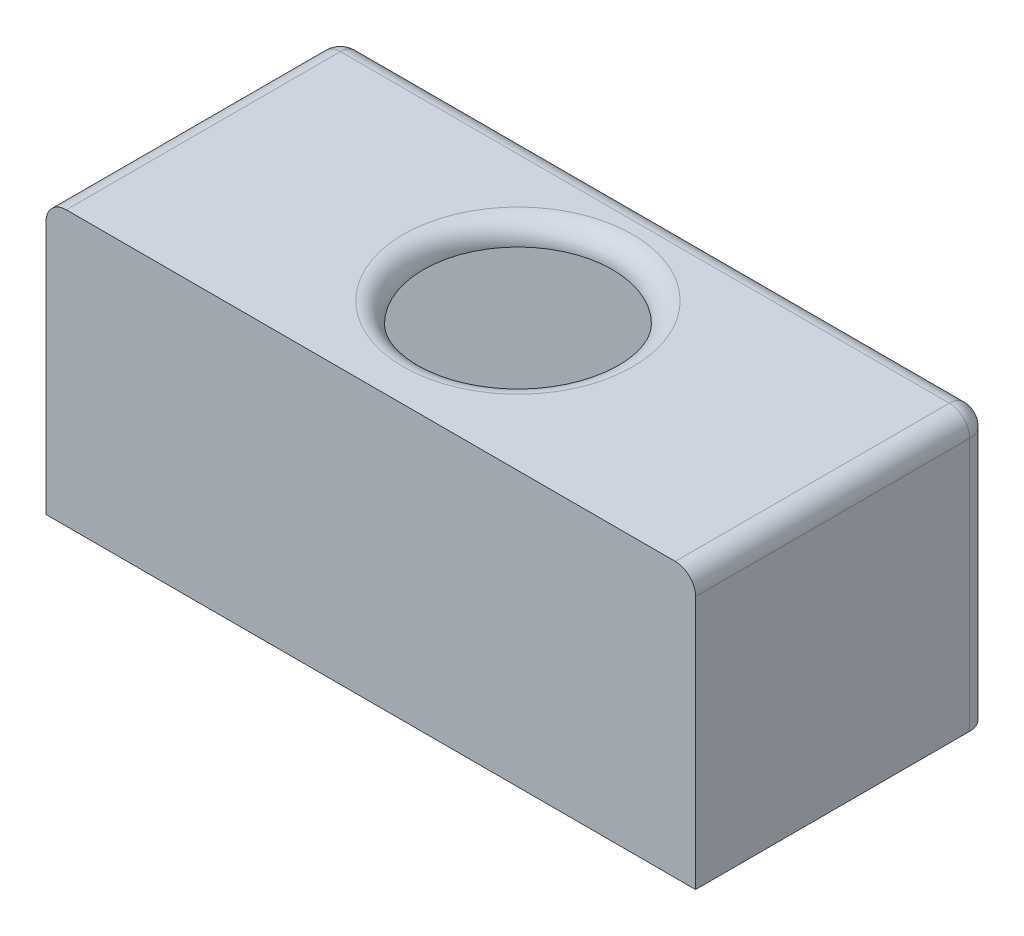
ISO-10303-21;
HEADER;
FILE_DESCRIPTION(('STEP AP214'),'2;1');
FILE_NAME('part.step','',(''),(''),'','','');
FILE_SCHEMA(('AUTOMOTIVE_DESIGN { 1 0 10303 214 1 1 1 1 }'));
ENDSEC;
DATA;
#1=APPLICATION_CONTEXT('core data for automotive mechanical design processes');
#2=APPLICATION_PROTOCOL_DEFINITION('international standard','automotive_design',2000,#1);
#3=PRODUCT_CONTEXT('',#1,'mechanical');
#4=PRODUCT('Part','Part','',(#3));
#5=PRODUCT_RELATED_PRODUCT_CATEGORY('part','',(#4));
#6=PRODUCT_DEFINITION_FORMATION('','',#4);
#7=PRODUCT_DEFINITION_CONTEXT('part definition',#1,'design');
#8=PRODUCT_DEFINITION('design','',#6,#7);
#9=PRODUCT_DEFINITION_SHAPE('','',#8);
#10=(LENGTH_UNIT() NAMED_UNIT(*) SI_UNIT(.MILLI.,.METRE.));
#11=(NAMED_UNIT(*) PLANE_ANGLE_UNIT() SI_UNIT($,.RADIAN.));
#12=(NAMED_UNIT(*) SI_UNIT($,.STERADIAN.) SOLID_ANGLE_UNIT());
#13=UNCERTAINTY_MEASURE_WITH_UNIT(LENGTH_MEASURE(1.E-05),#10,'distance_accuracy_value','');
#14=(GEOMETRIC_REPRESENTATION_CONTEXT(3) GLOBAL_UNCERTAINTY_ASSIGNED_CONTEXT((#13)) GLOBAL_UNIT_ASSIGNED_CONTEXT((#10,
#11,#12)) REPRESENTATION_CONTEXT('',''));
#15=CARTESIAN_POINT('',(0.,0.,0.));
#16=DIRECTION('',(0.,0.,1.));
#17=DIRECTION('',(1.,0.,0.));
#18=AXIS2_PLACEMENT_3D('',#15,#16,#17);
#19=CARTESIAN_POINT('',(-31.5092810457516,31.75,-17.2653594771242));
#20=DIRECTION('',(1.,0.,0.));
#21=DIRECTION('',(0.,0.,-1.));
#22=AXIS2_PLACEMENT_3D('',#19,#20,#21);
#23=PLANE('',#22);
#24=DIRECTION('',(0.,-1.,0.));
#25=VECTOR('',#24,1.);
#26=CARTESIAN_POINT('',(-31.5092810457516,31.75,17.0246405228758));
#27=LINE('',#26,#25);
#28=CARTESIAN_POINT('',(-31.5092810457516,31.75,17.0246405228758));
#29=VERTEX_POINT('',#28);
#30=CARTESIAN_POINT('',(-31.5092810457516,0.,17.0246405228758));
#31=VERTEX_POINT('',#30);
#32=EDGE_CURVE('E175',#29,#31,#27,.T.);
#33=ORIENTED_EDGE('',*,*,#32,.F.);
#34=DIRECTION('',(0.,0.,1.));
#35=VECTOR('',#34,1.);
#36=CARTESIAN_POINT('',(-31.5092810457516,31.75,-19.8053594771242));
#37=LINE('',#36,#35);
#38=CARTESIAN_POINT('',(-31.5092810457516,31.75,-17.2653594771242));
#39=VERTEX_POINT('',#38);
#40=EDGE_CURVE('E230',#29,#39,#37,.F.);
#41=ORIENTED_EDGE('',*,*,#40,.T.);
#42=DIRECTION('',(0.,-1.,0.));
#43=VECTOR('',#42,1.);
#44=CARTESIAN_POINT('',(-31.5092810457516,31.75,-17.2653594771242));
#45=LINE('',#44,#43);
#46=CARTESIAN_POINT('',(-31.5092810457516,0.,-17.2653594771242));
#47=VERTEX_POINT('',#46);
#48=EDGE_CURVE('E227',#39,#47,#45,.T.);
#49=ORIENTED_EDGE('',*,*,#48,.T.);
#50=DIRECTION('',(0.,0.,1.));
#51=VECTOR('',#50,1.);
#52=CARTESIAN_POINT('',(-31.5092810457516,0.,-17.2653594771242));
#53=LINE('',#52,#51);
#54=EDGE_CURVE('E164',#47,#31,#53,.T.);
#55=ORIENTED_EDGE('',*,*,#54,.T.);
#56=EDGE_LOOP('',(#33,#41,#49,#55));
#57=FACE_BOUND('',#56,.T.);
#58=ADVANCED_FACE('F46',(#57),#23,.F.);
#59=CARTESIAN_POINT('',(-28.9692810457516,31.75,17.0246405228758));
#60=DIRECTION('',(0.,0.,-1.));
#61=DIRECTION('',(-1.,0.,0.));
#62=AXIS2_PLACEMENT_3D('',#59,#60,#61);
#63=PLANE('',#62);
#64=DIRECTION('',(0.,-1.,0.));
#65=VECTOR('',#64,1.);
#66=CARTESIAN_POINT('',(49.7707189542484,31.75,17.0246405228758));
#67=LINE('',#66,#65);
#68=CARTESIAN_POINT('',(49.7707189542484,31.75,17.0246405228758));
#69=VERTEX_POINT('',#68);
#70=CARTESIAN_POINT('',(49.7707189542484,0.,17.0246405228758));
#71=VERTEX_POINT('',#70);
#72=EDGE_CURVE('E180',#69,#71,#67,.T.);
#73=ORIENTED_EDGE('',*,*,#72,.F.);
#74=CARTESIAN_POINT('',(47.2307189542484,31.75,17.0246405228758));
#75=DIRECTION('',(0.,0.,-1.));
#76=DIRECTION('',(-1.,0.,0.));
#77=AXIS2_PLACEMENT_3D('',#74,#75,#76);
#78=CIRCLE('',#77,2.54);
#79=CARTESIAN_POINT('',(47.2307189542484,34.29,17.0246405228758));
#80=VERTEX_POINT('',#79);
#81=EDGE_CURVE('E224',#69,#80,#78,.F.);
#82=ORIENTED_EDGE('',*,*,#81,.T.);
#83=DIRECTION('',(1.,0.,0.));
#84=VECTOR('',#83,1.);
#85=CARTESIAN_POINT('',(-28.9692810457516,34.29,17.0246405228758));
#86=LINE('',#85,#84);
#87=CARTESIAN_POINT('',(-28.9692810457516,34.29,17.0246405228758));
#88=VERTEX_POINT('',#87);
#89=EDGE_CURVE('E183',#88,#80,#86,.T.);
#90=ORIENTED_EDGE('',*,*,#89,.F.);
#91=CARTESIAN_POINT('',(-28.9692810457516,31.75,17.0246405228758));
#92=DIRECTION('',(0.,0.,-1.));
#93=DIRECTION('',(-1.,0.,0.));
#94=AXIS2_PLACEMENT_3D('',#91,#92,#93);
#95=CIRCLE('',#94,2.54);
#96=EDGE_CURVE('E221',#88,#29,#95,.F.);
#97=ORIENTED_EDGE('',*,*,#96,.T.);
#98=ORIENTED_EDGE('',*,*,#32,.T.);
#99=DIRECTION('',(1.,0.,0.));
#100=VECTOR('',#99,1.);
#101=CARTESIAN_POINT('',(-28.9692810457516,0.,17.0246405228758));
#102=LINE('',#101,#100);
#103=EDGE_CURVE('E169',#31,#71,#102,.T.);
#104=ORIENTED_EDGE('',*,*,#103,.T.);
#105=EDGE_LOOP('',(#73,#82,#90,#97,#98,#104));
#106=FACE_BOUND('',#105,.T.);
#107=ADVANCED_FACE('F289',(#106),#63,.F.);
#108=CARTESIAN_POINT('',(49.7707189542484,31.75,-17.2653594771242));
#109=DIRECTION('',(-1.,0.,0.));
#110=DIRECTION('',(0.,0.,1.));
#111=AXIS2_PLACEMENT_3D('',#108,#109,#110);
#112=PLANE('',#111);
#113=DIRECTION('',(0.,-1.,0.));
#114=VECTOR('',#113,1.);
#115=CARTESIAN_POINT('',(49.7707189542484,31.75,-17.2653594771242));
#116=LINE('',#115,#114);
#117=CARTESIAN_POINT('',(49.7707189542484,0.,-17.2653594771242));
#118=VERTEX_POINT('',#117);
#119=CARTESIAN_POINT('',(49.7707189542484,31.75,-17.2653594771242));
#120=VERTEX_POINT('',#119);
#121=EDGE_CURVE('E215',#118,#120,#116,.F.);
#122=ORIENTED_EDGE('',*,*,#121,.T.);
#123=DIRECTION('',(0.,0.,-1.));
#124=VECTOR('',#123,1.);
#125=CARTESIAN_POINT('',(49.7707189542484,31.75,17.0246405228758));
#126=LINE('',#125,#124);
#127=EDGE_CURVE('E218',#120,#69,#126,.F.);
#128=ORIENTED_EDGE('',*,*,#127,.T.);
#129=ORIENTED_EDGE('',*,*,#72,.T.);
#130=DIRECTION('',(0.,0.,-1.));
#131=VECTOR('',#130,1.);
#132=CARTESIAN_POINT('',(49.7707189542484,0.,-17.2653594771242));
#133=LINE('',#132,#131);
#134=EDGE_CURVE('E190',#71,#118,#133,.T.);
#135=ORIENTED_EDGE('',*,*,#134,.T.);
#136=EDGE_LOOP('',(#122,#128,#129,#135));
#137=FACE_BOUND('',#136,.T.);
#138=ADVANCED_FACE('F287',(#137),#112,.F.);
#139=CARTESIAN_POINT('',(-28.9692810457516,31.75,-19.8053594771242));
#140=DIRECTION('',(0.,0.,1.));
#141=DIRECTION('',(1.,0.,0.));
#142=AXIS2_PLACEMENT_3D('',#139,#140,#141);
#143=PLANE('',#142);
#144=DIRECTION('',(-1.,0.,0.));
#145=VECTOR('',#144,1.);
#146=CARTESIAN_POINT('',(49.7707189542484,31.75,-19.8053594771242));
#147=LINE('',#146,#145);
#148=CARTESIAN_POINT('',(-28.9692810457516,31.75,-19.8053594771242));
#149=VERTEX_POINT('',#148);
#150=CARTESIAN_POINT('',(47.2307189542484,31.75,-19.8053594771242));
#151=VERTEX_POINT('',#150);
#152=EDGE_CURVE('E64',#149,#151,#147,.F.);
#153=ORIENTED_EDGE('',*,*,#152,.T.);
#154=DIRECTION('',(0.,-1.,0.));
#155=VECTOR('',#154,1.);
#156=CARTESIAN_POINT('',(47.2307189542484,31.75,-19.8053594771242));
#157=LINE('',#156,#155);
#158=CARTESIAN_POINT('',(47.2307189542484,0.,-19.8053594771242));
#159=VERTEX_POINT('',#158);
#160=EDGE_CURVE('E237',#151,#159,#157,.T.);
#161=ORIENTED_EDGE('',*,*,#160,.T.);
#162=DIRECTION('',(-1.,0.,0.));
#163=VECTOR('',#162,1.);
#164=CARTESIAN_POINT('',(-28.9692810457516,0.,-19.8053594771242));
#165=LINE('',#164,#163);
#166=CARTESIAN_POINT('',(-28.9692810457516,0.,-19.8053594771242));
#167=VERTEX_POINT('',#166);
#168=EDGE_CURVE('E186',#159,#167,#165,.T.);
#169=ORIENTED_EDGE('',*,*,#168,.T.);
#170=DIRECTION('',(0.,-1.,0.));
#171=VECTOR('',#170,1.);
#172=CARTESIAN_POINT('',(-28.9692810457516,31.75,-19.8053594771242));
#173=LINE('',#172,#171);
#174=EDGE_CURVE('E69',#167,#149,#173,.F.);
#175=ORIENTED_EDGE('',*,*,#174,.T.);
#176=EDGE_LOOP('',(#153,#161,#169,#175));
#177=FACE_BOUND('',#176,.T.);
#178=ADVANCED_FACE('F299',(#177),#143,.F.);
#179=CARTESIAN_POINT('',(0.,34.29,0.));
#180=DIRECTION('',(0.,1.,0.));
#181=DIRECTION('',(0.,0.,1.));
#182=AXIS2_PLACEMENT_3D('',#179,#180,#181);
#183=PLANE('',#182);
#184=ORIENTED_EDGE('',*,*,#89,.T.);
#185=DIRECTION('',(0.,0.,-1.));
#186=VECTOR('',#185,1.);
#187=CARTESIAN_POINT('',(47.2307189542484,34.29,-19.8053594771242));
#188=LINE('',#187,#186);
#189=CARTESIAN_POINT('',(47.2307189542484,34.29,-17.2653594771242));
#190=VERTEX_POINT('',#189);
#191=EDGE_CURVE('E211',#80,#190,#188,.T.);
#192=ORIENTED_EDGE('',*,*,#191,.T.);
#193=DIRECTION('',(-1.,0.,0.));
#194=VECTOR('',#193,1.);
#195=CARTESIAN_POINT('',(-31.5092810457516,34.29,-17.2653594771242));
#196=LINE('',#195,#194);
#197=CARTESIAN_POINT('',(-28.9692810457516,34.29,-17.2653594771242));
#198=VERTEX_POINT('',#197);
#199=EDGE_CURVE('E205',#190,#198,#196,.T.);
#200=ORIENTED_EDGE('',*,*,#199,.T.);
#201=DIRECTION('',(0.,0.,1.));
#202=VECTOR('',#201,1.);
#203=CARTESIAN_POINT('',(-28.9692810457516,34.29,17.0246405228758));
#204=LINE('',#203,#202);
#205=EDGE_CURVE('E208',#198,#88,#204,.T.);
#206=ORIENTED_EDGE('',*,*,#205,.T.);
#207=EDGE_LOOP('',(#184,#192,#200,#206));
#208=FACE_BOUND('',#207,.T.);
#209=CARTESIAN_POINT('',(9.13071895424836,34.29,-1.39035947712418));
#210=DIRECTION('',(0.,1.,0.));
#211=DIRECTION('',(0.,0.,1.));
#212=AXIS2_PLACEMENT_3D('',#209,#210,#211);
#213=CIRCLE('',#212,14.351);
#214=CARTESIAN_POINT('',(9.13071895424836,34.29,12.9606405228758));
#215=VERTEX_POINT('',#214);
#216=EDGE_CURVE('E179',#215,#215,#213,.F.);
#217=ORIENTED_EDGE('',*,*,#216,.T.);
#218=EDGE_LOOP('',(#217));
#219=FACE_BOUND('',#218,.T.);
#220=ADVANCED_FACE('F307',(#208,#219),#183,.T.);
#221=CARTESIAN_POINT('',(0.,0.,0.));
#222=DIRECTION('',(0.,1.,0.));
#223=DIRECTION('',(0.,0.,1.));
#224=AXIS2_PLACEMENT_3D('',#221,#222,#223);
#225=PLANE('',#224);
#226=DIRECTION('',(-1.,0.,0.));
#227=VECTOR('',#226,1.);
#228=CARTESIAN_POINT('',(-28.9692810457516,0.,-17.2653594771242));
#229=LINE('',#228,#227);
#230=CARTESIAN_POINT('',(47.2307189542484,0.,-17.2653594771242));
#231=VERTEX_POINT('',#230);
#232=CARTESIAN_POINT('',(-28.9692810457516,0.,-17.2653594771242));
#233=VERTEX_POINT('',#232);
#234=EDGE_CURVE('E158',#231,#233,#229,.T.);
#235=ORIENTED_EDGE('',*,*,#234,.T.);
#236=DIRECTION('',(0.,0.,1.));
#237=VECTOR('',#236,1.);
#238=CARTESIAN_POINT('',(-28.9692810457516,0.,-17.2653594771242));
#239=LINE('',#238,#237);
#240=CARTESIAN_POINT('',(-28.9692810457516,0.,14.4846405228758));
#241=VERTEX_POINT('',#240);
#242=EDGE_CURVE('E201',#233,#241,#239,.T.);
#243=ORIENTED_EDGE('',*,*,#242,.T.);
#244=DIRECTION('',(1.,0.,0.));
#245=VECTOR('',#244,1.);
#246=CARTESIAN_POINT('',(-28.9692810457516,0.,14.4846405228758));
#247=LINE('',#246,#245);
#248=CARTESIAN_POINT('',(47.2307189542484,0.,14.4846405228758));
#249=VERTEX_POINT('',#248);
#250=EDGE_CURVE('E162',#241,#249,#247,.T.);
#251=ORIENTED_EDGE('',*,*,#250,.T.);
#252=DIRECTION('',(0.,0.,-1.));
#253=VECTOR('',#252,1.);
#254=CARTESIAN_POINT('',(47.2307189542484,0.,-17.2653594771242));
#255=LINE('',#254,#253);
#256=EDGE_CURVE('E506',#249,#231,#255,.T.);
#257=ORIENTED_EDGE('',*,*,#256,.T.);
#258=EDGE_LOOP('',(#235,#243,#251,#257));
#259=FACE_BOUND('',#258,.T.);
#260=ORIENTED_EDGE('',*,*,#168,.F.);
#261=CARTESIAN_POINT('',(47.2307189542484,0.,-17.2653594771242));
#262=DIRECTION('',(0.,1.,0.));
#263=DIRECTION('',(0.,0.,1.));
#264=AXIS2_PLACEMENT_3D('',#261,#262,#263);
#265=CIRCLE('',#264,2.54);
#266=EDGE_CURVE('E11',#159,#118,#265,.F.);
#267=ORIENTED_EDGE('',*,*,#266,.T.);
#268=ORIENTED_EDGE('',*,*,#134,.F.);
#269=ORIENTED_EDGE('',*,*,#103,.F.);
#270=ORIENTED_EDGE('',*,*,#54,.F.);
#271=CARTESIAN_POINT('',(-28.9692810457516,0.,-17.2653594771242));
#272=DIRECTION('',(0.,1.,0.));
#273=DIRECTION('',(0.,0.,1.));
#274=AXIS2_PLACEMENT_3D('',#271,#272,#273);
#275=CIRCLE('',#274,2.54);
#276=EDGE_CURVE('E56',#47,#167,#275,.F.);
#277=ORIENTED_EDGE('',*,*,#276,.T.);
#278=EDGE_LOOP('',(#260,#267,#268,#269,#270,#277));
#279=FACE_BOUND('',#278,.T.);
#280=ADVANCED_FACE('F297',(#259,#279),#225,.F.);
#281=CARTESIAN_POINT('',(-28.9692810457516,31.75,-17.2653594771242));
#282=DIRECTION('',(1.,0.,0.));
#283=DIRECTION('',(0.,0.,-1.));
#284=AXIS2_PLACEMENT_3D('',#281,#282,#283);
#285=PLANE('',#284);
#286=ORIENTED_EDGE('',*,*,#242,.F.);
#287=DIRECTION('',(0.,-1.,0.));
#288=VECTOR('',#287,1.);
#289=CARTESIAN_POINT('',(-28.9692810457516,31.75,-17.2653594771242));
#290=LINE('',#289,#288);
#291=CARTESIAN_POINT('',(-28.9692810457516,31.75,-17.2653594771242));
#292=VERTEX_POINT('',#291);
#293=EDGE_CURVE('E156',#292,#233,#290,.T.);
#294=ORIENTED_EDGE('',*,*,#293,.F.);
#295=DIRECTION('',(0.,0.,1.));
#296=VECTOR('',#295,1.);
#297=CARTESIAN_POINT('',(-28.9692810457516,31.75,-17.2653594771242));
#298=LINE('',#297,#296);
#299=CARTESIAN_POINT('',(-28.9692810457516,31.75,14.4846405228758));
#300=VERTEX_POINT('',#299);
#301=EDGE_CURVE('E141',#292,#300,#298,.T.);
#302=ORIENTED_EDGE('',*,*,#301,.T.);
#303=DIRECTION('',(0.,-1.,0.));
#304=VECTOR('',#303,1.);
#305=CARTESIAN_POINT('',(-28.9692810457516,31.75,14.4846405228758));
#306=LINE('',#305,#304);
#307=EDGE_CURVE('E154',#300,#241,#306,.T.);
#308=ORIENTED_EDGE('',*,*,#307,.T.);
#309=EDGE_LOOP('',(#286,#294,#302,#308));
#310=FACE_BOUND('',#309,.T.);
#311=ADVANCED_FACE('F153',(#310),#285,.T.);
#312=CARTESIAN_POINT('',(-28.9692810457516,31.75,14.4846405228758));
#313=DIRECTION('',(0.,0.,-1.));
#314=DIRECTION('',(-1.,0.,0.));
#315=AXIS2_PLACEMENT_3D('',#312,#313,#314);
#316=PLANE('',#315);
#317=ORIENTED_EDGE('',*,*,#250,.F.);
#318=ORIENTED_EDGE('',*,*,#307,.F.);
#319=DIRECTION('',(1.,0.,0.));
#320=VECTOR('',#319,1.);
#321=CARTESIAN_POINT('',(-28.9692810457516,31.75,14.4846405228758));
#322=LINE('',#321,#320);
#323=CARTESIAN_POINT('',(47.2307189542484,31.75,14.4846405228758));
#324=VERTEX_POINT('',#323);
#325=EDGE_CURVE('E137',#300,#324,#322,.T.);
#326=ORIENTED_EDGE('',*,*,#325,.T.);
#327=DIRECTION('',(0.,-1.,0.));
#328=VECTOR('',#327,1.);
#329=CARTESIAN_POINT('',(47.2307189542484,31.75,14.4846405228758));
#330=LINE('',#329,#328);
#331=EDGE_CURVE('E165',#324,#249,#330,.T.);
#332=ORIENTED_EDGE('',*,*,#331,.T.);
#333=EDGE_LOOP('',(#317,#318,#326,#332));
#334=FACE_BOUND('',#333,.T.);
#335=ADVANCED_FACE('F160',(#334),#316,.T.);
#336=CARTESIAN_POINT('',(47.2307189542484,31.75,-17.2653594771242));
#337=DIRECTION('',(-1.,0.,0.));
#338=DIRECTION('',(0.,0.,1.));
#339=AXIS2_PLACEMENT_3D('',#336,#337,#338);
#340=PLANE('',#339);
#341=ORIENTED_EDGE('',*,*,#256,.F.);
#342=ORIENTED_EDGE('',*,*,#331,.F.);
#343=DIRECTION('',(0.,0.,-1.));
#344=VECTOR('',#343,1.);
#345=CARTESIAN_POINT('',(47.2307189542484,31.75,-17.2653594771242));
#346=LINE('',#345,#344);
#347=CARTESIAN_POINT('',(47.2307189542484,31.75,-17.2653594771242));
#348=VERTEX_POINT('',#347);
#349=EDGE_CURVE('E142',#324,#348,#346,.T.);
#350=ORIENTED_EDGE('',*,*,#349,.T.);
#351=DIRECTION('',(0.,-1.,0.));
#352=VECTOR('',#351,1.);
#353=CARTESIAN_POINT('',(47.2307189542484,31.75,-17.2653594771242));
#354=LINE('',#353,#352);
#355=EDGE_CURVE('E171',#348,#231,#354,.T.);
#356=ORIENTED_EDGE('',*,*,#355,.T.);
#357=EDGE_LOOP('',(#341,#342,#350,#356));
#358=FACE_BOUND('',#357,.T.);
#359=ADVANCED_FACE('F325',(#358),#340,.T.);
#360=CARTESIAN_POINT('',(-28.9692810457516,31.75,-17.2653594771242));
#361=DIRECTION('',(0.,0.,1.));
#362=DIRECTION('',(1.,0.,0.));
#363=AXIS2_PLACEMENT_3D('',#360,#361,#362);
#364=PLANE('',#363);
#365=ORIENTED_EDGE('',*,*,#234,.F.);
#366=ORIENTED_EDGE('',*,*,#355,.F.);
#367=DIRECTION('',(-1.,0.,0.));
#368=VECTOR('',#367,1.);
#369=CARTESIAN_POINT('',(-28.9692810457516,31.75,-17.2653594771242));
#370=LINE('',#369,#368);
#371=EDGE_CURVE('E515',#348,#292,#370,.T.);
#372=ORIENTED_EDGE('',*,*,#371,.T.);
#373=ORIENTED_EDGE('',*,*,#293,.T.);
#374=EDGE_LOOP('',(#365,#366,#372,#373));
#375=FACE_BOUND('',#374,.T.);
#376=ADVANCED_FACE('F318',(#375),#364,.T.);
#377=CARTESIAN_POINT('',(0.,31.75,0.));
#378=DIRECTION('',(0.,1.,0.));
#379=DIRECTION('',(0.,0.,1.));
#380=AXIS2_PLACEMENT_3D('',#377,#378,#379);
#381=PLANE('',#380);
#382=CARTESIAN_POINT('',(9.13071895424836,31.75,-1.39035947712418));
#383=DIRECTION('',(0.,1.,0.));
#384=DIRECTION('',(0.,0.,1.));
#385=AXIS2_PLACEMENT_3D('',#382,#383,#384);
#386=CIRCLE('',#385,11.811);
#387=CARTESIAN_POINT('',(9.13071895424836,31.75,10.4206405228758));
#388=VERTEX_POINT('',#387);
#389=EDGE_CURVE('E197',#388,#388,#386,.T.);
#390=ORIENTED_EDGE('',*,*,#389,.T.);
#391=EDGE_LOOP('',(#390));
#392=FACE_BOUND('',#391,.T.);
#393=ORIENTED_EDGE('',*,*,#301,.F.);
#394=ORIENTED_EDGE('',*,*,#371,.F.);
#395=ORIENTED_EDGE('',*,*,#349,.F.);
#396=ORIENTED_EDGE('',*,*,#325,.F.);
#397=EDGE_LOOP('',(#393,#394,#395,#396));
#398=FACE_BOUND('',#397,.T.);
#399=ADVANCED_FACE('F139',(#392,#398),#381,.F.);
#400=CARTESIAN_POINT('',(-28.9692810457516,31.75,0.));
#401=DIRECTION('',(0.,0.,-1.));
#402=DIRECTION('',(-1.,0.,0.));
#403=AXIS2_PLACEMENT_3D('',#400,#401,#402);
#404=CYLINDRICAL_SURFACE('',#403,2.54);
#405=ORIENTED_EDGE('',*,*,#96,.F.);
#406=ORIENTED_EDGE('',*,*,#205,.F.);
#407=CARTESIAN_POINT('',(-28.9692810457516,31.75,-17.2653594771242));
#408=DIRECTION('',(0.,0.,-1.));
#409=DIRECTION('',(-1.,0.,0.));
#410=AXIS2_PLACEMENT_3D('',#407,#408,#409);
#411=CIRCLE('',#410,2.54);
#412=EDGE_CURVE('E50',#39,#198,#411,.T.);
#413=ORIENTED_EDGE('',*,*,#412,.F.);
#414=ORIENTED_EDGE('',*,*,#40,.F.);
#415=EDGE_LOOP('',(#405,#406,#413,#414));
#416=FACE_BOUND('',#415,.T.);
#417=ADVANCED_FACE('F305',(#416),#404,.T.);
#418=CARTESIAN_POINT('',(-28.9692810457516,31.75,-17.2653594771242));
#419=DIRECTION('',(0.,-1.,0.));
#420=DIRECTION('',(0.,0.,-1.));
#421=AXIS2_PLACEMENT_3D('',#418,#419,#420);
#422=CYLINDRICAL_SURFACE('',#421,2.54);
#423=ORIENTED_EDGE('',*,*,#276,.F.);
#424=ORIENTED_EDGE('',*,*,#48,.F.);
#425=CARTESIAN_POINT('',(-28.9692810457516,31.75,-17.2653594771242));
#426=DIRECTION('',(0.,1.,0.));
#427=DIRECTION('',(0.,0.,1.));
#428=AXIS2_PLACEMENT_3D('',#425,#426,#427);
#429=CIRCLE('',#428,2.54);
#430=EDGE_CURVE('E256',#149,#39,#429,.T.);
#431=ORIENTED_EDGE('',*,*,#430,.F.);
#432=ORIENTED_EDGE('',*,*,#174,.F.);
#433=EDGE_LOOP('',(#423,#424,#431,#432));
#434=FACE_BOUND('',#433,.T.);
#435=ADVANCED_FACE('F301',(#434),#422,.T.);
#436=CARTESIAN_POINT('',(-28.9692810457516,31.75,-17.2653594771242));
#437=DIRECTION('',(-1.,0.,0.));
#438=DIRECTION('',(0.,0.,1.));
#439=AXIS2_PLACEMENT_3D('',#436,#437,#438);
#440=SPHERICAL_SURFACE('',#439,2.54);
#441=ORIENTED_EDGE('',*,*,#430,.T.);
#442=ORIENTED_EDGE('',*,*,#412,.T.);
#443=CARTESIAN_POINT('',(-28.9692810457516,31.75,-17.2653594771242));
#444=DIRECTION('',(-1.,0.,0.));
#445=DIRECTION('',(0.,0.,1.));
#446=AXIS2_PLACEMENT_3D('',#443,#444,#445);
#447=CIRCLE('',#446,2.54);
#448=EDGE_CURVE('E253',#149,#198,#447,.F.);
#449=ORIENTED_EDGE('',*,*,#448,.F.);
#450=EDGE_LOOP('',(#441,#442,#449));
#451=FACE_BOUND('',#450,.T.);
#452=ADVANCED_FACE('F264',(#451),#440,.T.);
#453=CARTESIAN_POINT('',(0.,31.75,-17.2653594771242));
#454=DIRECTION('',(1.,0.,0.));
#455=DIRECTION('',(0.,0.,-1.));
#456=AXIS2_PLACEMENT_3D('',#453,#454,#455);
#457=CYLINDRICAL_SURFACE('',#456,2.54);
#458=ORIENTED_EDGE('',*,*,#448,.T.);
#459=ORIENTED_EDGE('',*,*,#199,.F.);
#460=CARTESIAN_POINT('',(47.2307189542484,31.75,-17.2653594771242));
#461=DIRECTION('',(1.,0.,0.));
#462=DIRECTION('',(0.,1.,0.));
#463=AXIS2_PLACEMENT_3D('',#460,#461,#462);
#464=CIRCLE('',#463,2.54);
#465=EDGE_CURVE('E249',#151,#190,#464,.T.);
#466=ORIENTED_EDGE('',*,*,#465,.F.);
#467=ORIENTED_EDGE('',*,*,#152,.F.);
#468=EDGE_LOOP('',(#458,#459,#466,#467));
#469=FACE_BOUND('',#468,.T.);
#470=ADVANCED_FACE('F270',(#469),#457,.T.);
#471=CARTESIAN_POINT('',(47.2307189542484,31.75,-17.2653594771242));
#472=DIRECTION('',(0.,-1.,0.));
#473=DIRECTION('',(0.,0.,-1.));
#474=AXIS2_PLACEMENT_3D('',#471,#472,#473);
#475=CYLINDRICAL_SURFACE('',#474,2.54);
#476=ORIENTED_EDGE('',*,*,#266,.F.);
#477=ORIENTED_EDGE('',*,*,#160,.F.);
#478=CARTESIAN_POINT('',(47.2307189542484,31.75,-17.2653594771242));
#479=DIRECTION('',(0.,1.,0.));
#480=DIRECTION('',(0.,0.,1.));
#481=AXIS2_PLACEMENT_3D('',#478,#479,#480);
#482=CIRCLE('',#481,2.54);
#483=EDGE_CURVE('E245',#120,#151,#482,.T.);
#484=ORIENTED_EDGE('',*,*,#483,.F.);
#485=ORIENTED_EDGE('',*,*,#121,.F.);
#486=EDGE_LOOP('',(#476,#477,#484,#485));
#487=FACE_BOUND('',#486,.T.);
#488=ADVANCED_FACE('F280',(#487),#475,.T.);
#489=CARTESIAN_POINT('',(47.2307189542484,31.75,-17.2653594771242));
#490=DIRECTION('',(0.,0.,-1.));
#491=DIRECTION('',(-1.,0.,0.));
#492=AXIS2_PLACEMENT_3D('',#489,#490,#491);
#493=SPHERICAL_SURFACE('',#492,2.54);
#494=ORIENTED_EDGE('',*,*,#483,.T.);
#495=ORIENTED_EDGE('',*,*,#465,.T.);
#496=CARTESIAN_POINT('',(47.2307189542484,31.75,-17.2653594771242));
#497=DIRECTION('',(0.,0.,-1.));
#498=DIRECTION('',(-1.,0.,0.));
#499=AXIS2_PLACEMENT_3D('',#496,#497,#498);
#500=CIRCLE('',#499,2.54);
#501=EDGE_CURVE('E242',#120,#190,#500,.F.);
#502=ORIENTED_EDGE('',*,*,#501,.F.);
#503=EDGE_LOOP('',(#494,#495,#502));
#504=FACE_BOUND('',#503,.T.);
#505=ADVANCED_FACE('F275',(#504),#493,.T.);
#506=CARTESIAN_POINT('',(47.2307189542484,31.75,0.));
#507=DIRECTION('',(0.,0.,1.));
#508=DIRECTION('',(1.,0.,0.));
#509=AXIS2_PLACEMENT_3D('',#506,#507,#508);
#510=CYLINDRICAL_SURFACE('',#509,2.54);
#511=ORIENTED_EDGE('',*,*,#81,.F.);
#512=ORIENTED_EDGE('',*,*,#127,.F.);
#513=ORIENTED_EDGE('',*,*,#501,.T.);
#514=ORIENTED_EDGE('',*,*,#191,.F.);
#515=EDGE_LOOP('',(#511,#512,#513,#514));
#516=FACE_BOUND('',#515,.T.);
#517=ADVANCED_FACE('F283',(#516),#510,.T.);
#518=CARTESIAN_POINT('',(9.13071895424836,31.75,-1.39035947712418));
#519=DIRECTION('',(0.,1.,0.));
#520=DIRECTION('',(0.,0.,1.));
#521=AXIS2_PLACEMENT_3D('',#518,#519,#520);
#522=TOROIDAL_SURFACE('',#521,14.351,2.54);
#523=ORIENTED_EDGE('',*,*,#216,.F.);
#524=EDGE_LOOP('',(#523));
#525=FACE_BOUND('',#524,.T.);
#526=ORIENTED_EDGE('',*,*,#389,.F.);
#527=EDGE_LOOP('',(#526));
#528=FACE_BOUND('',#527,.T.);
#529=ADVANCED_FACE('F48',(#525,#528),#522,.T.);
#530=CLOSED_SHELL('',(#58,#107,#138,#178,#220,#280,#311,#335,#359,#376,#399,#417,#435,#452,#470,
#488,#505,#517,#529));
#531=MANIFOLD_SOLID_BREP('B2',#530);
#532=ADVANCED_BREP_SHAPE_REPRESENTATION('',(#18,#531),#14);
#533=SHAPE_DEFINITION_REPRESENTATION(#9,#532);
ENDSEC;
END-ISO-10303-21;
